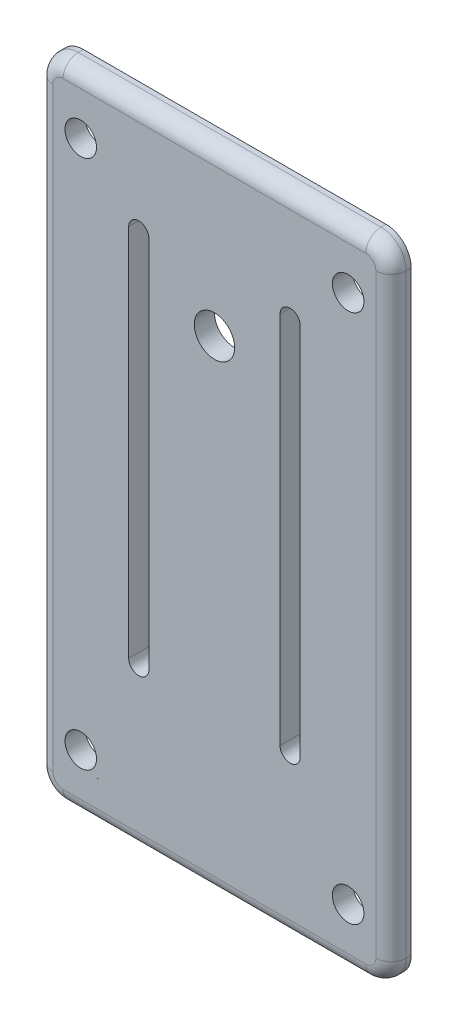
ISO-10303-21;
HEADER;
FILE_DESCRIPTION(('STEP AP214'),'2;1');
FILE_NAME('part.step','',(''),(''),'','','');
FILE_SCHEMA(('AUTOMOTIVE_DESIGN { 1 0 10303 214 1 1 1 1 }'));
ENDSEC;
DATA;
#1=APPLICATION_CONTEXT('core data for automotive mechanical design processes');
#2=APPLICATION_PROTOCOL_DEFINITION('international standard','automotive_design',2000,#1);
#3=PRODUCT_CONTEXT('',#1,'mechanical');
#4=PRODUCT('Part','Part','',(#3));
#5=PRODUCT_RELATED_PRODUCT_CATEGORY('part','',(#4));
#6=PRODUCT_DEFINITION_FORMATION('','',#4);
#7=PRODUCT_DEFINITION_CONTEXT('part definition',#1,'design');
#8=PRODUCT_DEFINITION('design','',#6,#7);
#9=PRODUCT_DEFINITION_SHAPE('','',#8);
#10=(LENGTH_UNIT() NAMED_UNIT(*) SI_UNIT(.MILLI.,.METRE.));
#11=(NAMED_UNIT(*) PLANE_ANGLE_UNIT() SI_UNIT($,.RADIAN.));
#12=(NAMED_UNIT(*) SI_UNIT($,.STERADIAN.) SOLID_ANGLE_UNIT());
#13=UNCERTAINTY_MEASURE_WITH_UNIT(LENGTH_MEASURE(1.E-05),#10,'distance_accuracy_value','');
#14=(GEOMETRIC_REPRESENTATION_CONTEXT(3) GLOBAL_UNCERTAINTY_ASSIGNED_CONTEXT((#13)) GLOBAL_UNIT_ASSIGNED_CONTEXT((#10,
#11,#12)) REPRESENTATION_CONTEXT('',''));
#15=CARTESIAN_POINT('',(0.,0.,0.));
#16=DIRECTION('',(0.,0.,1.));
#17=DIRECTION('',(1.,0.,0.));
#18=AXIS2_PLACEMENT_3D('',#15,#16,#17);
#19=CARTESIAN_POINT('',(-15.,-29.5,2.));
#20=DIRECTION('',(0.,0.,-1.));
#21=DIRECTION('',(-1.,0.,0.));
#22=AXIS2_PLACEMENT_3D('',#19,#20,#21);
#23=PLANE('',#22);
#24=DIRECTION('',(0.,1.,0.));
#25=VECTOR('',#24,1.);
#26=CARTESIAN_POINT('',(-6.49999999999999,-16.,2.));
#27=LINE('',#26,#25);
#28=CARTESIAN_POINT('',(-6.49999999999999,-16.,2.));
#29=VERTEX_POINT('',#28);
#30=CARTESIAN_POINT('',(-6.49999999999999,21.04,2.));
#31=VERTEX_POINT('',#30);
#32=EDGE_CURVE('E209',#29,#31,#27,.T.);
#33=ORIENTED_EDGE('',*,*,#32,.F.);
#34=CARTESIAN_POINT('',(-7.49999999999999,-16.,2.));
#35=DIRECTION('',(0.,0.,1.));
#36=DIRECTION('',(1.,0.,0.));
#37=AXIS2_PLACEMENT_3D('',#34,#35,#36);
#38=CIRCLE('',#37,0.999999999999999);
#39=CARTESIAN_POINT('',(-8.49999999999999,-16.,2.));
#40=VERTEX_POINT('',#39);
#41=EDGE_CURVE('E58',#40,#29,#38,.T.);
#42=ORIENTED_EDGE('',*,*,#41,.F.);
#43=DIRECTION('',(0.,-1.,0.));
#44=VECTOR('',#43,1.);
#45=CARTESIAN_POINT('',(-8.49999999999999,-16.,2.));
#46=LINE('',#45,#44);
#47=CARTESIAN_POINT('',(-8.49999999999999,21.04,2.));
#48=VERTEX_POINT('',#47);
#49=EDGE_CURVE('E200',#48,#40,#46,.T.);
#50=ORIENTED_EDGE('',*,*,#49,.F.);
#51=CARTESIAN_POINT('',(-7.49999999999999,21.04,2.));
#52=DIRECTION('',(0.,0.,1.));
#53=DIRECTION('',(1.,0.,0.));
#54=AXIS2_PLACEMENT_3D('',#51,#52,#53);
#55=CIRCLE('',#54,0.999999999999999);
#56=EDGE_CURVE('E203',#31,#48,#55,.T.);
#57=ORIENTED_EDGE('',*,*,#56,.F.);
#58=EDGE_LOOP('',(#33,#42,#50,#57));
#59=FACE_BOUND('',#58,.T.);
#60=DIRECTION('',(0.,1.,0.));
#61=VECTOR('',#60,1.);
#62=CARTESIAN_POINT('',(8.5,-16.,2.));
#63=LINE('',#62,#61);
#64=CARTESIAN_POINT('',(8.5,-16.,2.));
#65=VERTEX_POINT('',#64);
#66=CARTESIAN_POINT('',(8.5,21.04,2.));
#67=VERTEX_POINT('',#66);
#68=EDGE_CURVE('E235',#65,#67,#63,.T.);
#69=ORIENTED_EDGE('',*,*,#68,.F.);
#70=CARTESIAN_POINT('',(7.5,-16.,2.));
#71=DIRECTION('',(0.,0.,1.));
#72=DIRECTION('',(-1.,0.,0.));
#73=AXIS2_PLACEMENT_3D('',#70,#71,#72);
#74=CIRCLE('',#73,0.999999999999999);
#75=CARTESIAN_POINT('',(6.5,-16.,2.));
#76=VERTEX_POINT('',#75);
#77=EDGE_CURVE('E66',#76,#65,#74,.T.);
#78=ORIENTED_EDGE('',*,*,#77,.F.);
#79=DIRECTION('',(0.,-1.,0.));
#80=VECTOR('',#79,1.);
#81=CARTESIAN_POINT('',(6.5,-16.,2.));
#82=LINE('',#81,#80);
#83=CARTESIAN_POINT('',(6.5,21.04,2.));
#84=VERTEX_POINT('',#83);
#85=EDGE_CURVE('E228',#84,#76,#82,.T.);
#86=ORIENTED_EDGE('',*,*,#85,.F.);
#87=CARTESIAN_POINT('',(7.5,21.04,2.));
#88=DIRECTION('',(0.,0.,1.));
#89=DIRECTION('',(-1.,0.,0.));
#90=AXIS2_PLACEMENT_3D('',#87,#88,#89);
#91=CIRCLE('',#90,0.999999999999999);
#92=EDGE_CURVE('E231',#67,#84,#91,.T.);
#93=ORIENTED_EDGE('',*,*,#92,.F.);
#94=EDGE_LOOP('',(#69,#78,#86,#93));
#95=FACE_BOUND('',#94,.T.);
#96=CARTESIAN_POINT('',(0.,15.9,2.));
#97=DIRECTION('',(0.,0.,1.));
#98=DIRECTION('',(1.,0.,0.));
#99=AXIS2_PLACEMENT_3D('',#96,#97,#98);
#100=CIRCLE('',#99,2.);
#101=CARTESIAN_POINT('',(2.,15.9,2.));
#102=VERTEX_POINT('',#101);
#103=EDGE_CURVE('E215',#102,#102,#100,.T.);
#104=ORIENTED_EDGE('',*,*,#103,.F.);
#105=EDGE_LOOP('',(#104));
#106=FACE_BOUND('',#105,.T.);
#107=DIRECTION('',(0.,-1.,0.));
#108=VECTOR('',#107,1.);
#109=CARTESIAN_POINT('',(-16.,-29.5,2.));
#110=LINE('',#109,#108);
#111=CARTESIAN_POINT('',(-16.,29.5,2.));
#112=VERTEX_POINT('',#111);
#113=CARTESIAN_POINT('',(-16.,-29.5,2.));
#114=VERTEX_POINT('',#113);
#115=EDGE_CURVE('E331',#112,#114,#110,.T.);
#116=ORIENTED_EDGE('',*,*,#115,.T.);
#117=CARTESIAN_POINT('',(-15.,-29.5,2.));
#118=DIRECTION('',(0.,0.,-1.));
#119=DIRECTION('',(-1.,0.,0.));
#120=AXIS2_PLACEMENT_3D('',#117,#118,#119);
#121=CIRCLE('',#120,1.);
#122=CARTESIAN_POINT('',(-15.,-30.5,2.));
#123=VERTEX_POINT('',#122);
#124=EDGE_CURVE('E339',#114,#123,#121,.F.);
#125=ORIENTED_EDGE('',*,*,#124,.T.);
#126=DIRECTION('',(1.,0.,0.));
#127=VECTOR('',#126,1.);
#128=CARTESIAN_POINT('',(-15.,-30.5,2.));
#129=LINE('',#128,#127);
#130=CARTESIAN_POINT('',(15.,-30.5,2.));
#131=VERTEX_POINT('',#130);
#132=EDGE_CURVE('E337',#123,#131,#129,.T.);
#133=ORIENTED_EDGE('',*,*,#132,.T.);
#134=CARTESIAN_POINT('',(15.,-29.5,2.));
#135=DIRECTION('',(0.,0.,-1.));
#136=DIRECTION('',(-1.,0.,0.));
#137=AXIS2_PLACEMENT_3D('',#134,#135,#136);
#138=CIRCLE('',#137,1.);
#139=CARTESIAN_POINT('',(16.,-29.5,2.));
#140=VERTEX_POINT('',#139);
#141=EDGE_CURVE('E335',#131,#140,#138,.F.);
#142=ORIENTED_EDGE('',*,*,#141,.T.);
#143=DIRECTION('',(0.,1.,0.));
#144=VECTOR('',#143,1.);
#145=CARTESIAN_POINT('',(16.,-29.5,2.));
#146=LINE('',#145,#144);
#147=CARTESIAN_POINT('',(16.,29.5,2.));
#148=VERTEX_POINT('',#147);
#149=EDGE_CURVE('E333',#140,#148,#146,.T.);
#150=ORIENTED_EDGE('',*,*,#149,.T.);
#151=CARTESIAN_POINT('',(15.,29.5,2.));
#152=DIRECTION('',(0.,0.,-1.));
#153=DIRECTION('',(-1.,0.,0.));
#154=AXIS2_PLACEMENT_3D('',#151,#152,#153);
#155=CIRCLE('',#154,0.999999999999996);
#156=CARTESIAN_POINT('',(15.,30.5,2.));
#157=VERTEX_POINT('',#156);
#158=EDGE_CURVE('E329',#148,#157,#155,.F.);
#159=ORIENTED_EDGE('',*,*,#158,.T.);
#160=DIRECTION('',(-1.,0.,0.));
#161=VECTOR('',#160,1.);
#162=CARTESIAN_POINT('',(-15.,30.5,2.));
#163=LINE('',#162,#161);
#164=CARTESIAN_POINT('',(-15.,30.5,2.));
#165=VERTEX_POINT('',#164);
#166=EDGE_CURVE('E325',#157,#165,#163,.T.);
#167=ORIENTED_EDGE('',*,*,#166,.T.);
#168=CARTESIAN_POINT('',(-15.,29.5,2.));
#169=DIRECTION('',(0.,0.,-1.));
#170=DIRECTION('',(-1.,0.,0.));
#171=AXIS2_PLACEMENT_3D('',#168,#169,#170);
#172=CIRCLE('',#171,0.999999999999996);
#173=EDGE_CURVE('E327',#165,#112,#172,.F.);
#174=ORIENTED_EDGE('',*,*,#173,.T.);
#175=EDGE_LOOP('',(#116,#125,#133,#142,#150,#159,#167,#174));
#176=FACE_BOUND('',#175,.T.);
#177=CARTESIAN_POINT('',(-11.5563027665126,-27.8795667042709,2.));
#178=DIRECTION('',(0.,0.,1.));
#179=DIRECTION('',(1.,0.,0.));
#180=AXIS2_PLACEMENT_3D('',#177,#178,#179);
#181=CIRCLE('',#180,0.0196600325929192);
#182=CARTESIAN_POINT('',(-11.5366427339197,-27.8795667042709,2.));
#183=VERTEX_POINT('',#182);
#184=EDGE_CURVE('E280',#183,#183,#181,.T.);
#185=ORIENTED_EDGE('',*,*,#184,.F.);
#186=EDGE_LOOP('',(#185));
#187=FACE_BOUND('',#186,.T.);
#188=CARTESIAN_POINT('',(-13.25,-26.25,2.));
#189=DIRECTION('',(0.,0.,1.));
#190=DIRECTION('',(1.,0.,0.));
#191=AXIS2_PLACEMENT_3D('',#188,#189,#190);
#192=CIRCLE('',#191,1.5625);
#193=CARTESIAN_POINT('',(-11.6875,-26.25,2.));
#194=VERTEX_POINT('',#193);
#195=EDGE_CURVE('E274',#194,#194,#192,.T.);
#196=ORIENTED_EDGE('',*,*,#195,.F.);
#197=EDGE_LOOP('',(#196));
#198=FACE_BOUND('',#197,.T.);
#199=CARTESIAN_POINT('',(-13.25,26.25,2.));
#200=DIRECTION('',(0.,0.,1.));
#201=DIRECTION('',(-1.,0.,0.));
#202=AXIS2_PLACEMENT_3D('',#199,#200,#201);
#203=CIRCLE('',#202,1.5625);
#204=CARTESIAN_POINT('',(-14.8125,26.25,2.));
#205=VERTEX_POINT('',#204);
#206=EDGE_CURVE('E268',#205,#205,#203,.T.);
#207=ORIENTED_EDGE('',*,*,#206,.F.);
#208=EDGE_LOOP('',(#207));
#209=FACE_BOUND('',#208,.T.);
#210=CARTESIAN_POINT('',(13.25,-26.25,2.));
#211=DIRECTION('',(0.,0.,1.));
#212=DIRECTION('',(-1.,0.,0.));
#213=AXIS2_PLACEMENT_3D('',#210,#211,#212);
#214=CIRCLE('',#213,1.5625);
#215=CARTESIAN_POINT('',(11.6875,-26.25,2.));
#216=VERTEX_POINT('',#215);
#217=EDGE_CURVE('E262',#216,#216,#214,.T.);
#218=ORIENTED_EDGE('',*,*,#217,.F.);
#219=EDGE_LOOP('',(#218));
#220=FACE_BOUND('',#219,.T.);
#221=CARTESIAN_POINT('',(13.25,26.25,2.));
#222=DIRECTION('',(0.,0.,1.));
#223=DIRECTION('',(1.,0.,0.));
#224=AXIS2_PLACEMENT_3D('',#221,#222,#223);
#225=CIRCLE('',#224,1.5625);
#226=CARTESIAN_POINT('',(14.8125,26.25,2.));
#227=VERTEX_POINT('',#226);
#228=EDGE_CURVE('E255',#227,#227,#225,.T.);
#229=ORIENTED_EDGE('',*,*,#228,.F.);
#230=EDGE_LOOP('',(#229));
#231=FACE_BOUND('',#230,.T.);
#232=ADVANCED_FACE('F41',(#59,#95,#106,#176,#187,#198,#209,#220,#231),#23,.F.);
#233=CARTESIAN_POINT('',(-15.,-29.5,0.));
#234=DIRECTION('',(0.,0.,-1.));
#235=DIRECTION('',(-1.,0.,0.));
#236=AXIS2_PLACEMENT_3D('',#233,#234,#235);
#237=PLANE('',#236);
#238=CARTESIAN_POINT('',(-7.49999999999999,-16.,0.));
#239=DIRECTION('',(0.,0.,1.));
#240=DIRECTION('',(1.,0.,0.));
#241=AXIS2_PLACEMENT_3D('',#238,#239,#240);
#242=CIRCLE('',#241,0.999999999999999);
#243=CARTESIAN_POINT('',(-8.49999999999999,-16.,0.));
#244=VERTEX_POINT('',#243);
#245=CARTESIAN_POINT('',(-6.49999999999999,-16.,0.));
#246=VERTEX_POINT('',#245);
#247=EDGE_CURVE('E181',#244,#246,#242,.T.);
#248=ORIENTED_EDGE('',*,*,#247,.T.);
#249=DIRECTION('',(0.,1.,0.));
#250=VECTOR('',#249,1.);
#251=CARTESIAN_POINT('',(-6.49999999999999,-16.,0.));
#252=LINE('',#251,#250);
#253=CARTESIAN_POINT('',(-6.49999999999999,21.04,0.));
#254=VERTEX_POINT('',#253);
#255=EDGE_CURVE('E191',#246,#254,#252,.T.);
#256=ORIENTED_EDGE('',*,*,#255,.T.);
#257=CARTESIAN_POINT('',(-7.49999999999999,21.04,0.));
#258=DIRECTION('',(0.,0.,1.));
#259=DIRECTION('',(1.,0.,0.));
#260=AXIS2_PLACEMENT_3D('',#257,#258,#259);
#261=CIRCLE('',#260,0.999999999999999);
#262=CARTESIAN_POINT('',(-8.49999999999999,21.04,0.));
#263=VERTEX_POINT('',#262);
#264=EDGE_CURVE('E195',#254,#263,#261,.T.);
#265=ORIENTED_EDGE('',*,*,#264,.T.);
#266=DIRECTION('',(0.,-1.,0.));
#267=VECTOR('',#266,1.);
#268=CARTESIAN_POINT('',(-8.49999999999999,-16.,0.));
#269=LINE('',#268,#267);
#270=EDGE_CURVE('E187',#263,#244,#269,.T.);
#271=ORIENTED_EDGE('',*,*,#270,.T.);
#272=EDGE_LOOP('',(#248,#256,#265,#271));
#273=FACE_BOUND('',#272,.T.);
#274=CARTESIAN_POINT('',(7.5,-16.,0.));
#275=DIRECTION('',(0.,0.,1.));
#276=DIRECTION('',(-1.,0.,0.));
#277=AXIS2_PLACEMENT_3D('',#274,#275,#276);
#278=CIRCLE('',#277,0.999999999999999);
#279=CARTESIAN_POINT('',(6.5,-16.,0.));
#280=VERTEX_POINT('',#279);
#281=CARTESIAN_POINT('',(8.5,-16.,0.));
#282=VERTEX_POINT('',#281);
#283=EDGE_CURVE('E232',#280,#282,#278,.T.);
#284=ORIENTED_EDGE('',*,*,#283,.T.);
#285=DIRECTION('',(0.,1.,0.));
#286=VECTOR('',#285,1.);
#287=CARTESIAN_POINT('',(8.5,-16.,0.));
#288=LINE('',#287,#286);
#289=CARTESIAN_POINT('',(8.5,21.04,0.));
#290=VERTEX_POINT('',#289);
#291=EDGE_CURVE('E244',#282,#290,#288,.T.);
#292=ORIENTED_EDGE('',*,*,#291,.T.);
#293=CARTESIAN_POINT('',(7.5,21.04,0.));
#294=DIRECTION('',(0.,0.,1.));
#295=DIRECTION('',(-1.,0.,0.));
#296=AXIS2_PLACEMENT_3D('',#293,#294,#295);
#297=CIRCLE('',#296,0.999999999999999);
#298=CARTESIAN_POINT('',(6.5,21.04,0.));
#299=VERTEX_POINT('',#298);
#300=EDGE_CURVE('E241',#290,#299,#297,.T.);
#301=ORIENTED_EDGE('',*,*,#300,.T.);
#302=DIRECTION('',(0.,-1.,0.));
#303=VECTOR('',#302,1.);
#304=CARTESIAN_POINT('',(6.5,-16.,0.));
#305=LINE('',#304,#303);
#306=EDGE_CURVE('E221',#299,#280,#305,.T.);
#307=ORIENTED_EDGE('',*,*,#306,.T.);
#308=EDGE_LOOP('',(#284,#292,#301,#307));
#309=FACE_BOUND('',#308,.T.);
#310=CARTESIAN_POINT('',(0.,15.9,0.));
#311=DIRECTION('',(0.,0.,1.));
#312=DIRECTION('',(1.,0.,0.));
#313=AXIS2_PLACEMENT_3D('',#310,#311,#312);
#314=CIRCLE('',#313,2.);
#315=CARTESIAN_POINT('',(2.,15.9,0.));
#316=VERTEX_POINT('',#315);
#317=EDGE_CURVE('E249',#316,#316,#314,.T.);
#318=ORIENTED_EDGE('',*,*,#317,.T.);
#319=EDGE_LOOP('',(#318));
#320=FACE_BOUND('',#319,.T.);
#321=CARTESIAN_POINT('',(13.25,-26.25,0.));
#322=DIRECTION('',(0.,0.,1.));
#323=DIRECTION('',(-1.,0.,0.));
#324=AXIS2_PLACEMENT_3D('',#321,#322,#323);
#325=CIRCLE('',#324,1.5625);
#326=CARTESIAN_POINT('',(11.6875,-26.25,0.));
#327=VERTEX_POINT('',#326);
#328=EDGE_CURVE('E258',#327,#327,#325,.T.);
#329=ORIENTED_EDGE('',*,*,#328,.T.);
#330=EDGE_LOOP('',(#329));
#331=FACE_BOUND('',#330,.T.);
#332=CARTESIAN_POINT('',(-13.25,-26.25,0.));
#333=DIRECTION('',(0.,0.,1.));
#334=DIRECTION('',(1.,0.,0.));
#335=AXIS2_PLACEMENT_3D('',#332,#333,#334);
#336=CIRCLE('',#335,1.5625);
#337=CARTESIAN_POINT('',(-11.6875,-26.25,0.));
#338=VERTEX_POINT('',#337);
#339=EDGE_CURVE('E271',#338,#338,#336,.T.);
#340=ORIENTED_EDGE('',*,*,#339,.T.);
#341=EDGE_LOOP('',(#340));
#342=FACE_BOUND('',#341,.T.);
#343=CARTESIAN_POINT('',(-15.,-29.5,0.));
#344=DIRECTION('',(0.,0.,1.));
#345=DIRECTION('',(-1.,0.,0.));
#346=AXIS2_PLACEMENT_3D('',#343,#344,#345);
#347=CIRCLE('',#346,2.5);
#348=CARTESIAN_POINT('',(-17.5,-29.5,0.));
#349=VERTEX_POINT('',#348);
#350=CARTESIAN_POINT('',(-15.,-32.,0.));
#351=VERTEX_POINT('',#350);
#352=EDGE_CURVE('E283',#349,#351,#347,.T.);
#353=ORIENTED_EDGE('',*,*,#352,.F.);
#354=DIRECTION('',(0.,-1.,0.));
#355=VECTOR('',#354,1.);
#356=CARTESIAN_POINT('',(-17.5,-29.5,0.));
#357=LINE('',#356,#355);
#358=CARTESIAN_POINT('',(-17.5,29.5,0.));
#359=VERTEX_POINT('',#358);
#360=EDGE_CURVE('E306',#359,#349,#357,.T.);
#361=ORIENTED_EDGE('',*,*,#360,.F.);
#362=CARTESIAN_POINT('',(-15.,29.5,0.));
#363=DIRECTION('',(0.,0.,1.));
#364=DIRECTION('',(-1.,0.,0.));
#365=AXIS2_PLACEMENT_3D('',#362,#363,#364);
#366=CIRCLE('',#365,2.5);
#367=CARTESIAN_POINT('',(-15.,32.,0.));
#368=VERTEX_POINT('',#367);
#369=EDGE_CURVE('E303',#368,#359,#366,.T.);
#370=ORIENTED_EDGE('',*,*,#369,.F.);
#371=DIRECTION('',(-1.,0.,0.));
#372=VECTOR('',#371,1.);
#373=CARTESIAN_POINT('',(-15.,32.,0.));
#374=LINE('',#373,#372);
#375=CARTESIAN_POINT('',(15.,32.,0.));
#376=VERTEX_POINT('',#375);
#377=EDGE_CURVE('E300',#376,#368,#374,.T.);
#378=ORIENTED_EDGE('',*,*,#377,.F.);
#379=CARTESIAN_POINT('',(15.,29.5,0.));
#380=DIRECTION('',(0.,0.,1.));
#381=DIRECTION('',(-1.,0.,0.));
#382=AXIS2_PLACEMENT_3D('',#379,#380,#381);
#383=CIRCLE('',#382,2.5);
#384=CARTESIAN_POINT('',(17.5,29.5,0.));
#385=VERTEX_POINT('',#384);
#386=EDGE_CURVE('E297',#385,#376,#383,.T.);
#387=ORIENTED_EDGE('',*,*,#386,.F.);
#388=DIRECTION('',(0.,1.,0.));
#389=VECTOR('',#388,1.);
#390=CARTESIAN_POINT('',(17.5,-29.5,0.));
#391=LINE('',#390,#389);
#392=CARTESIAN_POINT('',(17.5,-29.5,0.));
#393=VERTEX_POINT('',#392);
#394=EDGE_CURVE('E294',#393,#385,#391,.T.);
#395=ORIENTED_EDGE('',*,*,#394,.F.);
#396=CARTESIAN_POINT('',(15.,-29.5,0.));
#397=DIRECTION('',(0.,0.,1.));
#398=DIRECTION('',(1.,0.,0.));
#399=AXIS2_PLACEMENT_3D('',#396,#397,#398);
#400=CIRCLE('',#399,2.5);
#401=CARTESIAN_POINT('',(15.,-32.,0.));
#402=VERTEX_POINT('',#401);
#403=EDGE_CURVE('E291',#402,#393,#400,.T.);
#404=ORIENTED_EDGE('',*,*,#403,.F.);
#405=DIRECTION('',(1.,0.,0.));
#406=VECTOR('',#405,1.);
#407=CARTESIAN_POINT('',(-15.,-32.,0.));
#408=LINE('',#407,#406);
#409=EDGE_CURVE('E288',#351,#402,#408,.T.);
#410=ORIENTED_EDGE('',*,*,#409,.F.);
#411=EDGE_LOOP('',(#353,#361,#370,#378,#387,#395,#404,#410));
#412=FACE_BOUND('',#411,.T.);
#413=CARTESIAN_POINT('',(-11.5563027665126,-27.8795667042709,0.));
#414=DIRECTION('',(0.,0.,1.));
#415=DIRECTION('',(1.,0.,0.));
#416=AXIS2_PLACEMENT_3D('',#413,#414,#415);
#417=CIRCLE('',#416,0.0196600325929192);
#418=CARTESIAN_POINT('',(-11.5366427339197,-27.8795667042709,0.));
#419=VERTEX_POINT('',#418);
#420=EDGE_CURVE('E277',#419,#419,#417,.T.);
#421=ORIENTED_EDGE('',*,*,#420,.T.);
#422=EDGE_LOOP('',(#421));
#423=FACE_BOUND('',#422,.T.);
#424=CARTESIAN_POINT('',(-13.25,26.25,0.));
#425=DIRECTION('',(0.,0.,1.));
#426=DIRECTION('',(-1.,0.,0.));
#427=AXIS2_PLACEMENT_3D('',#424,#425,#426);
#428=CIRCLE('',#427,1.5625);
#429=CARTESIAN_POINT('',(-14.8125,26.25,0.));
#430=VERTEX_POINT('',#429);
#431=EDGE_CURVE('E265',#430,#430,#428,.T.);
#432=ORIENTED_EDGE('',*,*,#431,.T.);
#433=EDGE_LOOP('',(#432));
#434=FACE_BOUND('',#433,.T.);
#435=CARTESIAN_POINT('',(13.25,26.25,0.));
#436=DIRECTION('',(0.,0.,1.));
#437=DIRECTION('',(1.,0.,0.));
#438=AXIS2_PLACEMENT_3D('',#435,#436,#437);
#439=CIRCLE('',#438,1.5625);
#440=CARTESIAN_POINT('',(14.8125,26.25,0.));
#441=VERTEX_POINT('',#440);
#442=EDGE_CURVE('E259',#441,#441,#439,.T.);
#443=ORIENTED_EDGE('',*,*,#442,.T.);
#444=EDGE_LOOP('',(#443));
#445=FACE_BOUND('',#444,.T.);
#446=ADVANCED_FACE('F197',(#273,#309,#320,#331,#342,#412,#423,#434,#445),#237,.T.);
#447=CARTESIAN_POINT('',(-15.,-29.5,2.));
#448=DIRECTION('',(0.,0.,-1.));
#449=DIRECTION('',(-1.,0.,0.));
#450=AXIS2_PLACEMENT_3D('',#447,#448,#449);
#451=CYLINDRICAL_SURFACE('',#450,2.5);
#452=DIRECTION('',(0.,0.,-1.));
#453=VECTOR('',#452,1.);
#454=CARTESIAN_POINT('',(-15.,-32.,2.));
#455=LINE('',#454,#453);
#456=CARTESIAN_POINT('',(-15.,-32.,0.5));
#457=VERTEX_POINT('',#456);
#458=EDGE_CURVE('E323',#457,#351,#455,.T.);
#459=ORIENTED_EDGE('',*,*,#458,.F.);
#460=CARTESIAN_POINT('',(-15.,-29.5,0.5));
#461=DIRECTION('',(0.,0.,-1.));
#462=DIRECTION('',(-1.,0.,0.));
#463=AXIS2_PLACEMENT_3D('',#460,#461,#462);
#464=CIRCLE('',#463,2.5);
#465=CARTESIAN_POINT('',(-17.5,-29.5,0.5));
#466=VERTEX_POINT('',#465);
#467=EDGE_CURVE('E342',#457,#466,#464,.T.);
#468=ORIENTED_EDGE('',*,*,#467,.T.);
#469=DIRECTION('',(0.,0.,-1.));
#470=VECTOR('',#469,1.);
#471=CARTESIAN_POINT('',(-17.5,-29.5,2.));
#472=LINE('',#471,#470);
#473=EDGE_CURVE('E309',#466,#349,#472,.T.);
#474=ORIENTED_EDGE('',*,*,#473,.T.);
#475=ORIENTED_EDGE('',*,*,#352,.T.);
#476=EDGE_LOOP('',(#459,#468,#474,#475));
#477=FACE_BOUND('',#476,.T.);
#478=ADVANCED_FACE('F437',(#477),#451,.T.);
#479=CARTESIAN_POINT('',(-15.,-32.,2.));
#480=DIRECTION('',(0.,1.,0.));
#481=DIRECTION('',(0.,0.,1.));
#482=AXIS2_PLACEMENT_3D('',#479,#480,#481);
#483=PLANE('',#482);
#484=DIRECTION('',(0.,0.,-1.));
#485=VECTOR('',#484,1.);
#486=CARTESIAN_POINT('',(15.,-32.,2.));
#487=LINE('',#486,#485);
#488=CARTESIAN_POINT('',(15.,-32.,0.5));
#489=VERTEX_POINT('',#488);
#490=EDGE_CURVE('E321',#489,#402,#487,.T.);
#491=ORIENTED_EDGE('',*,*,#490,.F.);
#492=DIRECTION('',(1.,0.,0.));
#493=VECTOR('',#492,1.);
#494=CARTESIAN_POINT('',(-15.,-32.,0.5));
#495=LINE('',#494,#493);
#496=EDGE_CURVE('E345',#489,#457,#495,.F.);
#497=ORIENTED_EDGE('',*,*,#496,.T.);
#498=ORIENTED_EDGE('',*,*,#458,.T.);
#499=ORIENTED_EDGE('',*,*,#409,.T.);
#500=EDGE_LOOP('',(#491,#497,#498,#499));
#501=FACE_BOUND('',#500,.T.);
#502=ADVANCED_FACE('F433',(#501),#483,.F.);
#503=CARTESIAN_POINT('',(15.,-29.5,2.));
#504=DIRECTION('',(0.,0.,-1.));
#505=DIRECTION('',(-1.,0.,0.));
#506=AXIS2_PLACEMENT_3D('',#503,#504,#505);
#507=CYLINDRICAL_SURFACE('',#506,2.5);
#508=DIRECTION('',(0.,0.,-1.));
#509=VECTOR('',#508,1.);
#510=CARTESIAN_POINT('',(17.5,-29.5,2.));
#511=LINE('',#510,#509);
#512=CARTESIAN_POINT('',(17.5,-29.5,0.5));
#513=VERTEX_POINT('',#512);
#514=EDGE_CURVE('E319',#513,#393,#511,.T.);
#515=ORIENTED_EDGE('',*,*,#514,.F.);
#516=CARTESIAN_POINT('',(15.,-29.5,0.5));
#517=DIRECTION('',(0.,0.,-1.));
#518=DIRECTION('',(-1.,0.,0.));
#519=AXIS2_PLACEMENT_3D('',#516,#517,#518);
#520=CIRCLE('',#519,2.5);
#521=EDGE_CURVE('E347',#513,#489,#520,.T.);
#522=ORIENTED_EDGE('',*,*,#521,.T.);
#523=ORIENTED_EDGE('',*,*,#490,.T.);
#524=ORIENTED_EDGE('',*,*,#403,.T.);
#525=EDGE_LOOP('',(#515,#522,#523,#524));
#526=FACE_BOUND('',#525,.T.);
#527=ADVANCED_FACE('F431',(#526),#507,.T.);
#528=CARTESIAN_POINT('',(17.5,-29.5,2.));
#529=DIRECTION('',(-1.,0.,0.));
#530=DIRECTION('',(0.,0.,1.));
#531=AXIS2_PLACEMENT_3D('',#528,#529,#530);
#532=PLANE('',#531);
#533=DIRECTION('',(0.,0.,-1.));
#534=VECTOR('',#533,1.);
#535=CARTESIAN_POINT('',(17.5,29.5,2.));
#536=LINE('',#535,#534);
#537=CARTESIAN_POINT('',(17.5,29.5,0.5));
#538=VERTEX_POINT('',#537);
#539=EDGE_CURVE('E317',#538,#385,#536,.T.);
#540=ORIENTED_EDGE('',*,*,#539,.F.);
#541=DIRECTION('',(0.,1.,0.));
#542=VECTOR('',#541,1.);
#543=CARTESIAN_POINT('',(17.5,-29.5,0.5));
#544=LINE('',#543,#542);
#545=EDGE_CURVE('E351',#538,#513,#544,.F.);
#546=ORIENTED_EDGE('',*,*,#545,.T.);
#547=ORIENTED_EDGE('',*,*,#514,.T.);
#548=ORIENTED_EDGE('',*,*,#394,.T.);
#549=EDGE_LOOP('',(#540,#546,#547,#548));
#550=FACE_BOUND('',#549,.T.);
#551=ADVANCED_FACE('F391',(#550),#532,.F.);
#552=CARTESIAN_POINT('',(15.,29.5,2.));
#553=DIRECTION('',(0.,0.,-1.));
#554=DIRECTION('',(-1.,0.,0.));
#555=AXIS2_PLACEMENT_3D('',#552,#553,#554);
#556=CYLINDRICAL_SURFACE('',#555,2.5);
#557=DIRECTION('',(0.,0.,-1.));
#558=VECTOR('',#557,1.);
#559=CARTESIAN_POINT('',(15.,32.,2.));
#560=LINE('',#559,#558);
#561=CARTESIAN_POINT('',(15.,32.,0.5));
#562=VERTEX_POINT('',#561);
#563=EDGE_CURVE('E315',#562,#376,#560,.T.);
#564=ORIENTED_EDGE('',*,*,#563,.F.);
#565=CARTESIAN_POINT('',(15.,29.5,0.5));
#566=DIRECTION('',(0.,0.,-1.));
#567=DIRECTION('',(-1.,0.,0.));
#568=AXIS2_PLACEMENT_3D('',#565,#566,#567);
#569=CIRCLE('',#568,2.5);
#570=EDGE_CURVE('E349',#562,#538,#569,.T.);
#571=ORIENTED_EDGE('',*,*,#570,.T.);
#572=ORIENTED_EDGE('',*,*,#539,.T.);
#573=ORIENTED_EDGE('',*,*,#386,.T.);
#574=EDGE_LOOP('',(#564,#571,#572,#573));
#575=FACE_BOUND('',#574,.T.);
#576=ADVANCED_FACE('F389',(#575),#556,.T.);
#577=CARTESIAN_POINT('',(-15.,32.,2.));
#578=DIRECTION('',(0.,-1.,0.));
#579=DIRECTION('',(0.,0.,-1.));
#580=AXIS2_PLACEMENT_3D('',#577,#578,#579);
#581=PLANE('',#580);
#582=DIRECTION('',(0.,0.,-1.));
#583=VECTOR('',#582,1.);
#584=CARTESIAN_POINT('',(-15.,32.,2.));
#585=LINE('',#584,#583);
#586=CARTESIAN_POINT('',(-15.,32.,0.5));
#587=VERTEX_POINT('',#586);
#588=EDGE_CURVE('E313',#587,#368,#585,.T.);
#589=ORIENTED_EDGE('',*,*,#588,.F.);
#590=DIRECTION('',(-1.,0.,0.));
#591=VECTOR('',#590,1.);
#592=CARTESIAN_POINT('',(-15.,32.,0.5));
#593=LINE('',#592,#591);
#594=EDGE_CURVE('E11',#587,#562,#593,.F.);
#595=ORIENTED_EDGE('',*,*,#594,.T.);
#596=ORIENTED_EDGE('',*,*,#563,.T.);
#597=ORIENTED_EDGE('',*,*,#377,.T.);
#598=EDGE_LOOP('',(#589,#595,#596,#597));
#599=FACE_BOUND('',#598,.T.);
#600=ADVANCED_FACE('F404',(#599),#581,.F.);
#601=CARTESIAN_POINT('',(-15.,29.5,2.));
#602=DIRECTION('',(0.,0.,-1.));
#603=DIRECTION('',(-1.,0.,0.));
#604=AXIS2_PLACEMENT_3D('',#601,#602,#603);
#605=CYLINDRICAL_SURFACE('',#604,2.5);
#606=DIRECTION('',(0.,0.,-1.));
#607=VECTOR('',#606,1.);
#608=CARTESIAN_POINT('',(-17.5,29.5,2.));
#609=LINE('',#608,#607);
#610=CARTESIAN_POINT('',(-17.5,29.5,0.5));
#611=VERTEX_POINT('',#610);
#612=EDGE_CURVE('E311',#611,#359,#609,.T.);
#613=ORIENTED_EDGE('',*,*,#612,.F.);
#614=CARTESIAN_POINT('',(-15.,29.5,0.5));
#615=DIRECTION('',(0.,0.,-1.));
#616=DIRECTION('',(-1.,0.,0.));
#617=AXIS2_PLACEMENT_3D('',#614,#615,#616);
#618=CIRCLE('',#617,2.5);
#619=EDGE_CURVE('E353',#611,#587,#618,.T.);
#620=ORIENTED_EDGE('',*,*,#619,.T.);
#621=ORIENTED_EDGE('',*,*,#588,.T.);
#622=ORIENTED_EDGE('',*,*,#369,.T.);
#623=EDGE_LOOP('',(#613,#620,#621,#622));
#624=FACE_BOUND('',#623,.T.);
#625=ADVANCED_FACE('F407',(#624),#605,.T.);
#626=CARTESIAN_POINT('',(-17.5,-29.5,2.));
#627=DIRECTION('',(1.,0.,0.));
#628=DIRECTION('',(0.,0.,-1.));
#629=AXIS2_PLACEMENT_3D('',#626,#627,#628);
#630=PLANE('',#629);
#631=ORIENTED_EDGE('',*,*,#473,.F.);
#632=DIRECTION('',(0.,-1.,0.));
#633=VECTOR('',#632,1.);
#634=CARTESIAN_POINT('',(-17.5,-29.5,0.5));
#635=LINE('',#634,#633);
#636=EDGE_CURVE('E50',#466,#611,#635,.F.);
#637=ORIENTED_EDGE('',*,*,#636,.T.);
#638=ORIENTED_EDGE('',*,*,#612,.T.);
#639=ORIENTED_EDGE('',*,*,#360,.T.);
#640=EDGE_LOOP('',(#631,#637,#638,#639));
#641=FACE_BOUND('',#640,.T.);
#642=ADVANCED_FACE('F441',(#641),#630,.F.);
#643=CARTESIAN_POINT('',(-11.5563027665126,-27.8795667042709,2.));
#644=DIRECTION('',(0.,0.,-1.));
#645=DIRECTION('',(-1.,0.,0.));
#646=AXIS2_PLACEMENT_3D('',#643,#644,#645);
#647=CYLINDRICAL_SURFACE('',#646,0.0196600325929192);
#648=ORIENTED_EDGE('',*,*,#184,.T.);
#649=EDGE_LOOP('',(#648));
#650=FACE_BOUND('',#649,.T.);
#651=ORIENTED_EDGE('',*,*,#420,.F.);
#652=EDGE_LOOP('',(#651));
#653=FACE_BOUND('',#652,.T.);
#654=ADVANCED_FACE('F443',(#650,#653),#647,.F.);
#655=CARTESIAN_POINT('',(-13.25,-26.25,2.));
#656=DIRECTION('',(0.,0.,-1.));
#657=DIRECTION('',(-1.,0.,0.));
#658=AXIS2_PLACEMENT_3D('',#655,#656,#657);
#659=CYLINDRICAL_SURFACE('',#658,1.5625);
#660=ORIENTED_EDGE('',*,*,#195,.T.);
#661=EDGE_LOOP('',(#660));
#662=FACE_BOUND('',#661,.T.);
#663=ORIENTED_EDGE('',*,*,#339,.F.);
#664=EDGE_LOOP('',(#663));
#665=FACE_BOUND('',#664,.T.);
#666=ADVANCED_FACE('F450',(#662,#665),#659,.F.);
#667=CARTESIAN_POINT('',(-13.25,26.25,2.));
#668=DIRECTION('',(0.,0.,-1.));
#669=DIRECTION('',(-1.,0.,0.));
#670=AXIS2_PLACEMENT_3D('',#667,#668,#669);
#671=CYLINDRICAL_SURFACE('',#670,1.5625);
#672=ORIENTED_EDGE('',*,*,#206,.T.);
#673=EDGE_LOOP('',(#672));
#674=FACE_BOUND('',#673,.T.);
#675=ORIENTED_EDGE('',*,*,#431,.F.);
#676=EDGE_LOOP('',(#675));
#677=FACE_BOUND('',#676,.T.);
#678=ADVANCED_FACE('F466',(#674,#677),#671,.F.);
#679=CARTESIAN_POINT('',(13.25,-26.25,2.));
#680=DIRECTION('',(0.,0.,-1.));
#681=DIRECTION('',(-1.,0.,0.));
#682=AXIS2_PLACEMENT_3D('',#679,#680,#681);
#683=CYLINDRICAL_SURFACE('',#682,1.5625);
#684=ORIENTED_EDGE('',*,*,#217,.T.);
#685=EDGE_LOOP('',(#684));
#686=FACE_BOUND('',#685,.T.);
#687=ORIENTED_EDGE('',*,*,#328,.F.);
#688=EDGE_LOOP('',(#687));
#689=FACE_BOUND('',#688,.T.);
#690=ADVANCED_FACE('F470',(#686,#689),#683,.F.);
#691=CARTESIAN_POINT('',(13.25,26.25,2.));
#692=DIRECTION('',(0.,0.,-1.));
#693=DIRECTION('',(-1.,0.,0.));
#694=AXIS2_PLACEMENT_3D('',#691,#692,#693);
#695=CYLINDRICAL_SURFACE('',#694,1.5625);
#696=ORIENTED_EDGE('',*,*,#228,.T.);
#697=EDGE_LOOP('',(#696));
#698=FACE_BOUND('',#697,.T.);
#699=ORIENTED_EDGE('',*,*,#442,.F.);
#700=EDGE_LOOP('',(#699));
#701=FACE_BOUND('',#700,.T.);
#702=ADVANCED_FACE('F474',(#698,#701),#695,.F.);
#703=CARTESIAN_POINT('',(15.,29.5,0.5));
#704=DIRECTION('',(0.,0.,-1.));
#705=DIRECTION('',(-1.,0.,0.));
#706=AXIS2_PLACEMENT_3D('',#703,#704,#705);
#707=DEGENERATE_TOROIDAL_SURFACE('',#706,0.999999999999996,1.5,.T.);
#708=CARTESIAN_POINT('',(16.,29.5,0.5));
#709=DIRECTION('',(0.,-1.,0.));
#710=DIRECTION('',(0.,0.,-1.));
#711=AXIS2_PLACEMENT_3D('',#708,#709,#710);
#712=CIRCLE('',#711,1.5);
#713=EDGE_CURVE('E370',#538,#148,#712,.T.);
#714=ORIENTED_EDGE('',*,*,#713,.F.);
#715=ORIENTED_EDGE('',*,*,#570,.F.);
#716=CARTESIAN_POINT('',(15.,30.5,0.5));
#717=DIRECTION('',(-1.,0.,0.));
#718=DIRECTION('',(0.,0.,1.));
#719=AXIS2_PLACEMENT_3D('',#716,#717,#718);
#720=CIRCLE('',#719,1.5);
#721=EDGE_CURVE('E45',#157,#562,#720,.T.);
#722=ORIENTED_EDGE('',*,*,#721,.F.);
#723=ORIENTED_EDGE('',*,*,#158,.F.);
#724=EDGE_LOOP('',(#714,#715,#722,#723));
#725=FACE_BOUND('',#724,.T.);
#726=ADVANCED_FACE('F43',(#725),#707,.T.);
#727=CARTESIAN_POINT('',(-15.,30.5,0.5));
#728=DIRECTION('',(-1.,0.,0.));
#729=DIRECTION('',(0.,0.,1.));
#730=AXIS2_PLACEMENT_3D('',#727,#728,#729);
#731=CYLINDRICAL_SURFACE('',#730,1.5);
#732=ORIENTED_EDGE('',*,*,#721,.T.);
#733=ORIENTED_EDGE('',*,*,#594,.F.);
#734=CARTESIAN_POINT('',(-15.,30.5,0.5));
#735=DIRECTION('',(-1.,0.,0.));
#736=DIRECTION('',(0.,0.,1.));
#737=AXIS2_PLACEMENT_3D('',#734,#735,#736);
#738=CIRCLE('',#737,1.5);
#739=EDGE_CURVE('E368',#165,#587,#738,.T.);
#740=ORIENTED_EDGE('',*,*,#739,.F.);
#741=ORIENTED_EDGE('',*,*,#166,.F.);
#742=EDGE_LOOP('',(#732,#733,#740,#741));
#743=FACE_BOUND('',#742,.T.);
#744=ADVANCED_FACE('F381',(#743),#731,.T.);
#745=CARTESIAN_POINT('',(16.,-29.5,0.5));
#746=DIRECTION('',(0.,1.,0.));
#747=DIRECTION('',(0.,0.,1.));
#748=AXIS2_PLACEMENT_3D('',#745,#746,#747);
#749=CYLINDRICAL_SURFACE('',#748,1.5);
#750=ORIENTED_EDGE('',*,*,#713,.T.);
#751=ORIENTED_EDGE('',*,*,#149,.F.);
#752=CARTESIAN_POINT('',(16.,-29.5,0.5));
#753=DIRECTION('',(0.,-1.,0.));
#754=DIRECTION('',(0.,0.,-1.));
#755=AXIS2_PLACEMENT_3D('',#752,#753,#754);
#756=CIRCLE('',#755,1.5);
#757=EDGE_CURVE('E365',#513,#140,#756,.T.);
#758=ORIENTED_EDGE('',*,*,#757,.F.);
#759=ORIENTED_EDGE('',*,*,#545,.F.);
#760=EDGE_LOOP('',(#750,#751,#758,#759));
#761=FACE_BOUND('',#760,.T.);
#762=ADVANCED_FACE('F423',(#761),#749,.T.);
#763=CARTESIAN_POINT('',(-15.,29.5,0.5));
#764=DIRECTION('',(0.,0.,-1.));
#765=DIRECTION('',(-1.,0.,0.));
#766=AXIS2_PLACEMENT_3D('',#763,#764,#765);
#767=DEGENERATE_TOROIDAL_SURFACE('',#766,0.999999999999996,1.5,.T.);
#768=ORIENTED_EDGE('',*,*,#739,.T.);
#769=ORIENTED_EDGE('',*,*,#619,.F.);
#770=CARTESIAN_POINT('',(-16.,29.5,0.5));
#771=DIRECTION('',(0.,-1.,0.));
#772=DIRECTION('',(0.,0.,-1.));
#773=AXIS2_PLACEMENT_3D('',#770,#771,#772);
#774=CIRCLE('',#773,1.5);
#775=EDGE_CURVE('E362',#112,#611,#774,.T.);
#776=ORIENTED_EDGE('',*,*,#775,.F.);
#777=ORIENTED_EDGE('',*,*,#173,.F.);
#778=EDGE_LOOP('',(#768,#769,#776,#777));
#779=FACE_BOUND('',#778,.T.);
#780=ADVANCED_FACE('F411',(#779),#767,.T.);
#781=CARTESIAN_POINT('',(15.,-29.5,0.5));
#782=DIRECTION('',(0.,0.,-1.));
#783=DIRECTION('',(-1.,0.,0.));
#784=AXIS2_PLACEMENT_3D('',#781,#782,#783);
#785=DEGENERATE_TOROIDAL_SURFACE('',#784,1.,1.5,.T.);
#786=ORIENTED_EDGE('',*,*,#757,.T.);
#787=ORIENTED_EDGE('',*,*,#141,.F.);
#788=CARTESIAN_POINT('',(15.,-30.5,0.5));
#789=DIRECTION('',(-1.,0.,0.));
#790=DIRECTION('',(0.,0.,1.));
#791=AXIS2_PLACEMENT_3D('',#788,#789,#790);
#792=CIRCLE('',#791,1.5);
#793=EDGE_CURVE('E359',#489,#131,#792,.T.);
#794=ORIENTED_EDGE('',*,*,#793,.F.);
#795=ORIENTED_EDGE('',*,*,#521,.F.);
#796=EDGE_LOOP('',(#786,#787,#794,#795));
#797=FACE_BOUND('',#796,.T.);
#798=ADVANCED_FACE('F426',(#797),#785,.T.);
#799=CARTESIAN_POINT('',(-16.,-29.5,0.5));
#800=DIRECTION('',(0.,-1.,0.));
#801=DIRECTION('',(0.,0.,-1.));
#802=AXIS2_PLACEMENT_3D('',#799,#800,#801);
#803=CYLINDRICAL_SURFACE('',#802,1.5);
#804=ORIENTED_EDGE('',*,*,#775,.T.);
#805=ORIENTED_EDGE('',*,*,#636,.F.);
#806=CARTESIAN_POINT('',(-16.,-29.5,0.5));
#807=DIRECTION('',(0.,-1.,0.));
#808=DIRECTION('',(0.,0.,-1.));
#809=AXIS2_PLACEMENT_3D('',#806,#807,#808);
#810=CIRCLE('',#809,1.5);
#811=EDGE_CURVE('E357',#114,#466,#810,.T.);
#812=ORIENTED_EDGE('',*,*,#811,.F.);
#813=ORIENTED_EDGE('',*,*,#115,.F.);
#814=EDGE_LOOP('',(#804,#805,#812,#813));
#815=FACE_BOUND('',#814,.T.);
#816=ADVANCED_FACE('F416',(#815),#803,.T.);
#817=CARTESIAN_POINT('',(-15.,-30.5,0.5));
#818=DIRECTION('',(1.,0.,0.));
#819=DIRECTION('',(0.,0.,-1.));
#820=AXIS2_PLACEMENT_3D('',#817,#818,#819);
#821=CYLINDRICAL_SURFACE('',#820,1.5);
#822=ORIENTED_EDGE('',*,*,#793,.T.);
#823=ORIENTED_EDGE('',*,*,#132,.F.);
#824=CARTESIAN_POINT('',(-15.,-30.5,0.5));
#825=DIRECTION('',(-1.,0.,0.));
#826=DIRECTION('',(0.,0.,1.));
#827=AXIS2_PLACEMENT_3D('',#824,#825,#826);
#828=CIRCLE('',#827,1.5);
#829=EDGE_CURVE('E252',#457,#123,#828,.T.);
#830=ORIENTED_EDGE('',*,*,#829,.F.);
#831=ORIENTED_EDGE('',*,*,#496,.F.);
#832=EDGE_LOOP('',(#822,#823,#830,#831));
#833=FACE_BOUND('',#832,.T.);
#834=ADVANCED_FACE('F565',(#833),#821,.T.);
#835=CARTESIAN_POINT('',(-15.,-29.5,0.5));
#836=DIRECTION('',(0.,0.,-1.));
#837=DIRECTION('',(-1.,0.,0.));
#838=AXIS2_PLACEMENT_3D('',#835,#836,#837);
#839=DEGENERATE_TOROIDAL_SURFACE('',#838,1.,1.5,.T.);
#840=ORIENTED_EDGE('',*,*,#811,.T.);
#841=ORIENTED_EDGE('',*,*,#467,.F.);
#842=ORIENTED_EDGE('',*,*,#829,.T.);
#843=ORIENTED_EDGE('',*,*,#124,.F.);
#844=EDGE_LOOP('',(#840,#841,#842,#843));
#845=FACE_BOUND('',#844,.T.);
#846=ADVANCED_FACE('F482',(#845),#839,.T.);
#847=CARTESIAN_POINT('',(0.,15.9,0.));
#848=DIRECTION('',(0.,0.,1.));
#849=DIRECTION('',(1.,0.,0.));
#850=AXIS2_PLACEMENT_3D('',#847,#848,#849);
#851=CYLINDRICAL_SURFACE('',#850,2.);
#852=ORIENTED_EDGE('',*,*,#317,.F.);
#853=EDGE_LOOP('',(#852));
#854=FACE_BOUND('',#853,.T.);
#855=ORIENTED_EDGE('',*,*,#103,.T.);
#856=EDGE_LOOP('',(#855));
#857=FACE_BOUND('',#856,.T.);
#858=ADVANCED_FACE('F479',(#854,#857),#851,.F.);
#859=CARTESIAN_POINT('',(7.5,-16.,0.));
#860=DIRECTION('',(0.,0.,1.));
#861=DIRECTION('',(1.,0.,0.));
#862=AXIS2_PLACEMENT_3D('',#859,#860,#861);
#863=CYLINDRICAL_SURFACE('',#862,0.999999999999999);
#864=ORIENTED_EDGE('',*,*,#77,.T.);
#865=DIRECTION('',(0.,0.,1.));
#866=VECTOR('',#865,1.);
#867=CARTESIAN_POINT('',(8.5,-16.,0.));
#868=LINE('',#867,#866);
#869=EDGE_CURVE('E219',#282,#65,#868,.T.);
#870=ORIENTED_EDGE('',*,*,#869,.F.);
#871=ORIENTED_EDGE('',*,*,#283,.F.);
#872=DIRECTION('',(0.,0.,1.));
#873=VECTOR('',#872,1.);
#874=CARTESIAN_POINT('',(6.5,-16.,0.));
#875=LINE('',#874,#873);
#876=EDGE_CURVE('E226',#280,#76,#875,.T.);
#877=ORIENTED_EDGE('',*,*,#876,.T.);
#878=EDGE_LOOP('',(#864,#870,#871,#877));
#879=FACE_BOUND('',#878,.T.);
#880=ADVANCED_FACE('F481',(#879),#863,.F.);
#881=CARTESIAN_POINT('',(6.5,-16.,0.));
#882=DIRECTION('',(-1.,0.,0.));
#883=DIRECTION('',(0.,0.,1.));
#884=AXIS2_PLACEMENT_3D('',#881,#882,#883);
#885=PLANE('',#884);
#886=ORIENTED_EDGE('',*,*,#85,.T.);
#887=ORIENTED_EDGE('',*,*,#876,.F.);
#888=ORIENTED_EDGE('',*,*,#306,.F.);
#889=DIRECTION('',(0.,0.,1.));
#890=VECTOR('',#889,1.);
#891=CARTESIAN_POINT('',(6.5,21.04,0.));
#892=LINE('',#891,#890);
#893=EDGE_CURVE('E224',#299,#84,#892,.T.);
#894=ORIENTED_EDGE('',*,*,#893,.T.);
#895=EDGE_LOOP('',(#886,#887,#888,#894));
#896=FACE_BOUND('',#895,.T.);
#897=ADVANCED_FACE('F484',(#896),#885,.F.);
#898=CARTESIAN_POINT('',(7.5,21.04,0.));
#899=DIRECTION('',(0.,0.,1.));
#900=DIRECTION('',(1.,0.,0.));
#901=AXIS2_PLACEMENT_3D('',#898,#899,#900);
#902=CYLINDRICAL_SURFACE('',#901,0.999999999999999);
#903=ORIENTED_EDGE('',*,*,#92,.T.);
#904=ORIENTED_EDGE('',*,*,#893,.F.);
#905=ORIENTED_EDGE('',*,*,#300,.F.);
#906=DIRECTION('',(0.,0.,1.));
#907=VECTOR('',#906,1.);
#908=CARTESIAN_POINT('',(8.5,21.04,0.));
#909=LINE('',#908,#907);
#910=EDGE_CURVE('E222',#290,#67,#909,.T.);
#911=ORIENTED_EDGE('',*,*,#910,.T.);
#912=EDGE_LOOP('',(#903,#904,#905,#911));
#913=FACE_BOUND('',#912,.T.);
#914=ADVANCED_FACE('F487',(#913),#902,.F.);
#915=CARTESIAN_POINT('',(8.5,-16.,0.));
#916=DIRECTION('',(1.,0.,0.));
#917=DIRECTION('',(0.,0.,-1.));
#918=AXIS2_PLACEMENT_3D('',#915,#916,#917);
#919=PLANE('',#918);
#920=ORIENTED_EDGE('',*,*,#68,.T.);
#921=ORIENTED_EDGE('',*,*,#910,.F.);
#922=ORIENTED_EDGE('',*,*,#291,.F.);
#923=ORIENTED_EDGE('',*,*,#869,.T.);
#924=EDGE_LOOP('',(#920,#921,#922,#923));
#925=FACE_BOUND('',#924,.T.);
#926=ADVANCED_FACE('F491',(#925),#919,.F.);
#927=CARTESIAN_POINT('',(-7.49999999999999,-16.,0.));
#928=DIRECTION('',(0.,0.,1.));
#929=DIRECTION('',(1.,0.,0.));
#930=AXIS2_PLACEMENT_3D('',#927,#928,#929);
#931=CYLINDRICAL_SURFACE('',#930,0.999999999999999);
#932=ORIENTED_EDGE('',*,*,#41,.T.);
#933=DIRECTION('',(0.,0.,1.));
#934=VECTOR('',#933,1.);
#935=CARTESIAN_POINT('',(-6.49999999999999,-16.,0.));
#936=LINE('',#935,#934);
#937=EDGE_CURVE('E177',#246,#29,#936,.T.);
#938=ORIENTED_EDGE('',*,*,#937,.F.);
#939=ORIENTED_EDGE('',*,*,#247,.F.);
#940=DIRECTION('',(0.,0.,1.));
#941=VECTOR('',#940,1.);
#942=CARTESIAN_POINT('',(-8.49999999999999,-16.,0.));
#943=LINE('',#942,#941);
#944=EDGE_CURVE('E213',#244,#40,#943,.T.);
#945=ORIENTED_EDGE('',*,*,#944,.T.);
#946=EDGE_LOOP('',(#932,#938,#939,#945));
#947=FACE_BOUND('',#946,.T.);
#948=ADVANCED_FACE('F179',(#947),#931,.F.);
#949=CARTESIAN_POINT('',(-8.49999999999999,-16.,0.));
#950=DIRECTION('',(-1.,0.,0.));
#951=DIRECTION('',(0.,0.,1.));
#952=AXIS2_PLACEMENT_3D('',#949,#950,#951);
#953=PLANE('',#952);
#954=ORIENTED_EDGE('',*,*,#49,.T.);
#955=ORIENTED_EDGE('',*,*,#944,.F.);
#956=ORIENTED_EDGE('',*,*,#270,.F.);
#957=DIRECTION('',(0.,0.,1.));
#958=VECTOR('',#957,1.);
#959=CARTESIAN_POINT('',(-8.49999999999999,21.04,0.));
#960=LINE('',#959,#958);
#961=EDGE_CURVE('E216',#263,#48,#960,.T.);
#962=ORIENTED_EDGE('',*,*,#961,.T.);
#963=EDGE_LOOP('',(#954,#955,#956,#962));
#964=FACE_BOUND('',#963,.T.);
#965=ADVANCED_FACE('F500',(#964),#953,.F.);
#966=CARTESIAN_POINT('',(-7.49999999999999,21.04,0.));
#967=DIRECTION('',(0.,0.,1.));
#968=DIRECTION('',(1.,0.,0.));
#969=AXIS2_PLACEMENT_3D('',#966,#967,#968);
#970=CYLINDRICAL_SURFACE('',#969,0.999999999999999);
#971=ORIENTED_EDGE('',*,*,#56,.T.);
#972=ORIENTED_EDGE('',*,*,#961,.F.);
#973=ORIENTED_EDGE('',*,*,#264,.F.);
#974=DIRECTION('',(0.,0.,1.));
#975=VECTOR('',#974,1.);
#976=CARTESIAN_POINT('',(-6.49999999999999,21.04,0.));
#977=LINE('',#976,#975);
#978=EDGE_CURVE('E186',#254,#31,#977,.T.);
#979=ORIENTED_EDGE('',*,*,#978,.T.);
#980=EDGE_LOOP('',(#971,#972,#973,#979));
#981=FACE_BOUND('',#980,.T.);
#982=ADVANCED_FACE('F503',(#981),#970,.F.);
#983=CARTESIAN_POINT('',(-6.49999999999999,-16.,0.));
#984=DIRECTION('',(1.,0.,0.));
#985=DIRECTION('',(0.,0.,-1.));
#986=AXIS2_PLACEMENT_3D('',#983,#984,#985);
#987=PLANE('',#986);
#988=ORIENTED_EDGE('',*,*,#32,.T.);
#989=ORIENTED_EDGE('',*,*,#978,.F.);
#990=ORIENTED_EDGE('',*,*,#255,.F.);
#991=ORIENTED_EDGE('',*,*,#937,.T.);
#992=EDGE_LOOP('',(#988,#989,#990,#991));
#993=FACE_BOUND('',#992,.T.);
#994=ADVANCED_FACE('F192',(#993),#987,.F.);
#995=CLOSED_SHELL('',(#232,#446,#478,#502,#527,#551,#576,#600,#625,#642,#654,#666,#678,#690,
#702,#726,#744,#762,#780,#798,#816,#834,#846,#858,#880,#897,#914,#926,#948,#965,#982,#994));
#996=MANIFOLD_SOLID_BREP('B2',#995);
#997=ADVANCED_BREP_SHAPE_REPRESENTATION('',(#18,#996),#14);
#998=SHAPE_DEFINITION_REPRESENTATION(#9,#997);
ENDSEC;
END-ISO-10303-21;
